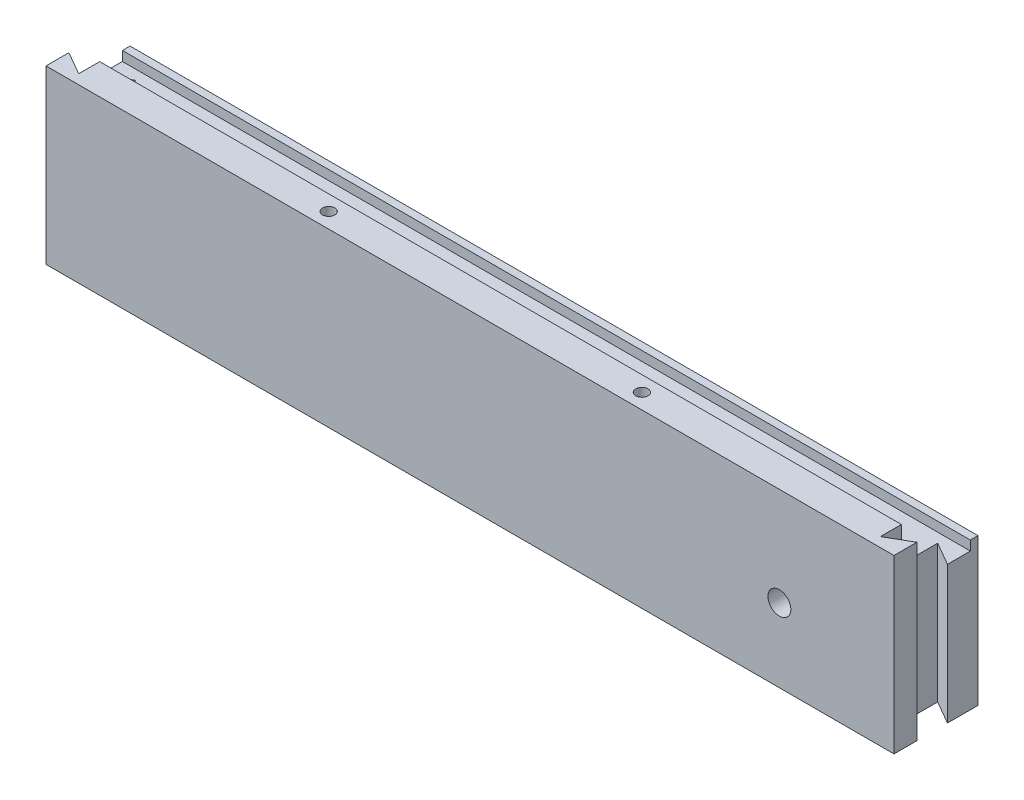
ISO-10303-21;
HEADER;
FILE_DESCRIPTION(('STEP AP214'),'2;1');
FILE_NAME('part.step','',(''),(''),'','','');
FILE_SCHEMA(('AUTOMOTIVE_DESIGN { 1 0 10303 214 1 1 1 1 }'));
ENDSEC;
DATA;
#1=APPLICATION_CONTEXT('core data for automotive mechanical design processes');
#2=APPLICATION_PROTOCOL_DEFINITION('international standard','automotive_design',2000,#1);
#3=PRODUCT_CONTEXT('',#1,'mechanical');
#4=PRODUCT('Part','Part','',(#3));
#5=PRODUCT_RELATED_PRODUCT_CATEGORY('part','',(#4));
#6=PRODUCT_DEFINITION_FORMATION('','',#4);
#7=PRODUCT_DEFINITION_CONTEXT('part definition',#1,'design');
#8=PRODUCT_DEFINITION('design','',#6,#7);
#9=PRODUCT_DEFINITION_SHAPE('','',#8);
#10=(LENGTH_UNIT() NAMED_UNIT(*) SI_UNIT(.MILLI.,.METRE.));
#11=(NAMED_UNIT(*) PLANE_ANGLE_UNIT() SI_UNIT($,.RADIAN.));
#12=(NAMED_UNIT(*) SI_UNIT($,.STERADIAN.) SOLID_ANGLE_UNIT());
#13=UNCERTAINTY_MEASURE_WITH_UNIT(LENGTH_MEASURE(1.E-05),#10,'distance_accuracy_value','');
#14=(GEOMETRIC_REPRESENTATION_CONTEXT(3) GLOBAL_UNCERTAINTY_ASSIGNED_CONTEXT((#13)) GLOBAL_UNIT_ASSIGNED_CONTEXT((#10,
#11,#12)) REPRESENTATION_CONTEXT('',''));
#15=CARTESIAN_POINT('',(0.,0.,0.));
#16=DIRECTION('',(0.,0.,1.));
#17=DIRECTION('',(1.,0.,0.));
#18=AXIS2_PLACEMENT_3D('',#15,#16,#17);
#19=CARTESIAN_POINT('',(0.,0.,0.));
#20=DIRECTION('',(0.,1.,0.));
#21=DIRECTION('',(0.,0.,1.));
#22=AXIS2_PLACEMENT_3D('',#19,#20,#21);
#23=PLANE('',#22);
#24=DIRECTION('',(0.,0.,1.));
#25=VECTOR('',#24,1.);
#26=CARTESIAN_POINT('',(236.,0.,0.));
#27=LINE('',#26,#25);
#28=CARTESIAN_POINT('',(236.,0.,1.99999999999989));
#29=VERTEX_POINT('',#28);
#30=CARTESIAN_POINT('',(236.,0.,8.));
#31=VERTEX_POINT('',#30);
#32=EDGE_CURVE('E310',#29,#31,#27,.T.);
#33=ORIENTED_EDGE('',*,*,#32,.T.);
#34=DIRECTION('',(-1.,0.,0.));
#35=VECTOR('',#34,1.);
#36=CARTESIAN_POINT('',(0.,0.,7.99999999999999));
#37=LINE('',#36,#35);
#38=CARTESIAN_POINT('',(14.,0.,7.99999999999999));
#39=VERTEX_POINT('',#38);
#40=EDGE_CURVE('E56',#31,#39,#37,.T.);
#41=ORIENTED_EDGE('',*,*,#40,.T.);
#42=DIRECTION('',(0.,0.,1.));
#43=VECTOR('',#42,1.);
#44=CARTESIAN_POINT('',(14.,0.,0.));
#45=LINE('',#44,#43);
#46=CARTESIAN_POINT('',(14.,0.,2.));
#47=VERTEX_POINT('',#46);
#48=EDGE_CURVE('E303',#47,#39,#45,.T.);
#49=ORIENTED_EDGE('',*,*,#48,.F.);
#50=DIRECTION('',(0.86602540378444,0.,0.499999999999998));
#51=VECTOR('',#50,1.);
#52=CARTESIAN_POINT('',(2.63397459621554,0.,-4.56217782649105));
#53=LINE('',#52,#51);
#54=CARTESIAN_POINT('',(20.0621778264911,0.,5.5));
#55=VERTEX_POINT('',#54);
#56=EDGE_CURVE('E313',#47,#55,#53,.T.);
#57=ORIENTED_EDGE('',*,*,#56,.T.);
#58=DIRECTION('',(0.,0.,-1.));
#59=VECTOR('',#58,1.);
#60=CARTESIAN_POINT('',(20.0621778264911,0.,0.));
#61=LINE('',#60,#59);
#62=CARTESIAN_POINT('',(20.0621778264911,0.,-9.5));
#63=VERTEX_POINT('',#62);
#64=EDGE_CURVE('E306',#55,#63,#61,.T.);
#65=ORIENTED_EDGE('',*,*,#64,.T.);
#66=DIRECTION('',(-0.86602540378444,0.,0.499999999999997));
#67=VECTOR('',#66,1.);
#68=CARTESIAN_POINT('',(0.901923788646657,0.,1.56217782649103));
#69=LINE('',#68,#67);
#70=CARTESIAN_POINT('',(14.,0.,-6.));
#71=VERTEX_POINT('',#70);
#72=EDGE_CURVE('E299',#63,#71,#69,.T.);
#73=ORIENTED_EDGE('',*,*,#72,.T.);
#74=CARTESIAN_POINT('',(14.,0.,-14.));
#75=VERTEX_POINT('',#74);
#76=EDGE_CURVE('E292',#75,#71,#45,.T.);
#77=ORIENTED_EDGE('',*,*,#76,.F.);
#78=DIRECTION('',(-1.,0.,0.));
#79=VECTOR('',#78,1.);
#80=CARTESIAN_POINT('',(14.,0.,-14.));
#81=LINE('',#80,#79);
#82=CARTESIAN_POINT('',(236.,0.,-14.));
#83=VERTEX_POINT('',#82);
#84=EDGE_CURVE('E189',#83,#75,#81,.T.);
#85=ORIENTED_EDGE('',*,*,#84,.F.);
#86=CARTESIAN_POINT('',(236.,0.,-6.00000000000012));
#87=VERTEX_POINT('',#86);
#88=EDGE_CURVE('E301',#83,#87,#27,.T.);
#89=ORIENTED_EDGE('',*,*,#88,.T.);
#90=DIRECTION('',(0.866025403784441,0.,0.499999999999996));
#91=VECTOR('',#90,1.);
#92=CARTESIAN_POINT('',(61.5980762113523,0.,-106.690997646563));
#93=LINE('',#92,#91);
#94=CARTESIAN_POINT('',(229.937822173509,0.,-9.5000000000001));
#95=VERTEX_POINT('',#94);
#96=EDGE_CURVE('E332',#95,#87,#93,.T.);
#97=ORIENTED_EDGE('',*,*,#96,.F.);
#98=DIRECTION('',(0.,0.,-1.));
#99=VECTOR('',#98,1.);
#100=CARTESIAN_POINT('',(229.937822173509,0.,-4.25470440681991E-13));
#101=LINE('',#100,#99);
#102=CARTESIAN_POINT('',(229.937822173509,0.,5.49999999999989));
#103=VERTEX_POINT('',#102);
#104=EDGE_CURVE('E328',#103,#95,#101,.T.);
#105=ORIENTED_EDGE('',*,*,#104,.F.);
#106=DIRECTION('',(-0.866025403784439,0.,0.499999999999999));
#107=VECTOR('',#106,1.);
#108=CARTESIAN_POINT('',(59.8660254037842,0.,103.690997646564));
#109=LINE('',#108,#107);
#110=EDGE_CURVE('E318',#29,#103,#109,.T.);
#111=ORIENTED_EDGE('',*,*,#110,.F.);
#112=EDGE_LOOP('',(#33,#41,#49,#57,#65,#73,#77,#85,#89,#97,#105,#111));
#113=FACE_BOUND('',#112,.T.);
#114=CARTESIAN_POINT('',(84.,0.,4.));
#115=DIRECTION('',(0.,1.,0.));
#116=DIRECTION('',(0.,0.,1.));
#117=AXIS2_PLACEMENT_3D('',#114,#115,#116);
#118=CIRCLE('',#117,1.59999999999999);
#119=CARTESIAN_POINT('',(84.,0.,5.59999999999999));
#120=VERTEX_POINT('',#119);
#121=EDGE_CURVE('E369',#120,#120,#118,.F.);
#122=ORIENTED_EDGE('',*,*,#121,.F.);
#123=EDGE_LOOP('',(#122));
#124=FACE_BOUND('',#123,.T.);
#125=CARTESIAN_POINT('',(166.,0.,4.));
#126=DIRECTION('',(0.,1.,0.));
#127=DIRECTION('',(0.,0.,1.));
#128=AXIS2_PLACEMENT_3D('',#125,#126,#127);
#129=CIRCLE('',#128,1.59999999999999);
#130=CARTESIAN_POINT('',(166.,0.,5.59999999999999));
#131=VERTEX_POINT('',#130);
#132=EDGE_CURVE('E171',#131,#131,#129,.T.);
#133=ORIENTED_EDGE('',*,*,#132,.T.);
#134=EDGE_LOOP('',(#133));
#135=FACE_BOUND('',#134,.T.);
#136=ADVANCED_FACE('F40',(#113,#124,#135),#23,.F.);
#137=CARTESIAN_POINT('',(0.,45.,0.));
#138=DIRECTION('',(0.,1.,0.));
#139=DIRECTION('',(0.,0.,1.));
#140=AXIS2_PLACEMENT_3D('',#137,#138,#139);
#141=PLANE('',#140);
#142=CARTESIAN_POINT('',(84.,45.,4.));
#143=DIRECTION('',(0.,1.,0.));
#144=DIRECTION('',(0.,0.,1.));
#145=AXIS2_PLACEMENT_3D('',#142,#143,#144);
#146=CIRCLE('',#145,1.59999999999999);
#147=CARTESIAN_POINT('',(84.,45.,5.59999999999999));
#148=VERTEX_POINT('',#147);
#149=EDGE_CURVE('E374',#148,#148,#146,.F.);
#150=ORIENTED_EDGE('',*,*,#149,.T.);
#151=EDGE_LOOP('',(#150));
#152=FACE_BOUND('',#151,.T.);
#153=DIRECTION('',(-1.,0.,0.));
#154=VECTOR('',#153,1.);
#155=CARTESIAN_POINT('',(0.,45.,7.99999999999999));
#156=LINE('',#155,#154);
#157=CARTESIAN_POINT('',(236.,45.,7.99999999999999));
#158=VERTEX_POINT('',#157);
#159=CARTESIAN_POINT('',(14.,45.,7.99999999999999));
#160=VERTEX_POINT('',#159);
#161=EDGE_CURVE('E154',#158,#160,#156,.T.);
#162=ORIENTED_EDGE('',*,*,#161,.F.);
#163=DIRECTION('',(0.,0.,-1.));
#164=VECTOR('',#163,1.);
#165=CARTESIAN_POINT('',(236.,45.,0.));
#166=LINE('',#165,#164);
#167=CARTESIAN_POINT('',(236.,45.,1.99999999999989));
#168=VERTEX_POINT('',#167);
#169=EDGE_CURVE('E165',#158,#168,#166,.T.);
#170=ORIENTED_EDGE('',*,*,#169,.T.);
#171=DIRECTION('',(0.866025403784439,0.,-0.499999999999999));
#172=VECTOR('',#171,1.);
#173=CARTESIAN_POINT('',(59.8660254037842,45.,103.690997646564));
#174=LINE('',#173,#172);
#175=CARTESIAN_POINT('',(229.937822173509,45.,5.49999999999989));
#176=VERTEX_POINT('',#175);
#177=EDGE_CURVE('E181',#176,#168,#174,.T.);
#178=ORIENTED_EDGE('',*,*,#177,.F.);
#179=DIRECTION('',(0.,0.,1.));
#180=VECTOR('',#179,1.);
#181=CARTESIAN_POINT('',(229.937822173509,45.,-4.25470440681991E-13));
#182=LINE('',#181,#180);
#183=CARTESIAN_POINT('',(229.937822173509,45.,0.));
#184=VERTEX_POINT('',#183);
#185=EDGE_CURVE('E275',#184,#176,#182,.T.);
#186=ORIENTED_EDGE('',*,*,#185,.F.);
#187=DIRECTION('',(1.,0.,0.));
#188=VECTOR('',#187,1.);
#189=CARTESIAN_POINT('',(0.,45.,0.));
#190=LINE('',#189,#188);
#191=CARTESIAN_POINT('',(20.0621778264911,45.,0.));
#192=VERTEX_POINT('',#191);
#193=EDGE_CURVE('E209',#192,#184,#190,.T.);
#194=ORIENTED_EDGE('',*,*,#193,.F.);
#195=DIRECTION('',(0.,0.,1.));
#196=VECTOR('',#195,1.);
#197=CARTESIAN_POINT('',(20.0621778264911,45.,0.));
#198=LINE('',#197,#196);
#199=CARTESIAN_POINT('',(20.0621778264911,45.,5.5));
#200=VERTEX_POINT('',#199);
#201=EDGE_CURVE('E269',#192,#200,#198,.T.);
#202=ORIENTED_EDGE('',*,*,#201,.T.);
#203=DIRECTION('',(-0.86602540378444,0.,-0.499999999999998));
#204=VECTOR('',#203,1.);
#205=CARTESIAN_POINT('',(2.63397459621554,45.,-4.56217782649105));
#206=LINE('',#205,#204);
#207=CARTESIAN_POINT('',(14.,45.,2.));
#208=VERTEX_POINT('',#207);
#209=EDGE_CURVE('E177',#200,#208,#206,.T.);
#210=ORIENTED_EDGE('',*,*,#209,.T.);
#211=DIRECTION('',(0.,0.,-1.));
#212=VECTOR('',#211,1.);
#213=CARTESIAN_POINT('',(14.,45.,0.));
#214=LINE('',#213,#212);
#215=EDGE_CURVE('E168',#160,#208,#214,.T.);
#216=ORIENTED_EDGE('',*,*,#215,.F.);
#217=EDGE_LOOP('',(#162,#170,#178,#186,#194,#202,#210,#216));
#218=FACE_BOUND('',#217,.T.);
#219=CARTESIAN_POINT('',(166.,45.,4.));
#220=DIRECTION('',(0.,1.,0.));
#221=DIRECTION('',(0.,0.,1.));
#222=AXIS2_PLACEMENT_3D('',#219,#220,#221);
#223=CIRCLE('',#222,1.59999999999999);
#224=CARTESIAN_POINT('',(166.,45.,5.59999999999999));
#225=VERTEX_POINT('',#224);
#226=EDGE_CURVE('E373',#225,#225,#223,.T.);
#227=ORIENTED_EDGE('',*,*,#226,.F.);
#228=EDGE_LOOP('',(#227));
#229=FACE_BOUND('',#228,.T.);
#230=ADVANCED_FACE('F162',(#152,#218,#229),#141,.T.);
#231=CARTESIAN_POINT('',(0.,38.5,0.));
#232=DIRECTION('',(0.,-1.,0.));
#233=DIRECTION('',(0.,0.,-1.));
#234=AXIS2_PLACEMENT_3D('',#231,#232,#233);
#235=PLANE('',#234);
#236=DIRECTION('',(0.,0.,1.));
#237=VECTOR('',#236,1.);
#238=CARTESIAN_POINT('',(236.,38.5,0.));
#239=LINE('',#238,#237);
#240=CARTESIAN_POINT('',(236.,38.5,-14.));
#241=VERTEX_POINT('',#240);
#242=CARTESIAN_POINT('',(236.,38.5,-12.));
#243=VERTEX_POINT('',#242);
#244=EDGE_CURVE('E183',#241,#243,#239,.T.);
#245=ORIENTED_EDGE('',*,*,#244,.F.);
#246=DIRECTION('',(1.,0.,0.));
#247=VECTOR('',#246,1.);
#248=CARTESIAN_POINT('',(14.,38.5,-14.));
#249=LINE('',#248,#247);
#250=CARTESIAN_POINT('',(14.,38.5,-14.));
#251=VERTEX_POINT('',#250);
#252=EDGE_CURVE('E198',#251,#241,#249,.T.);
#253=ORIENTED_EDGE('',*,*,#252,.F.);
#254=DIRECTION('',(0.,0.,1.));
#255=VECTOR('',#254,1.);
#256=CARTESIAN_POINT('',(14.,38.5,0.));
#257=LINE('',#256,#255);
#258=CARTESIAN_POINT('',(14.,38.5,-12.));
#259=VERTEX_POINT('',#258);
#260=EDGE_CURVE('E253',#251,#259,#257,.T.);
#261=ORIENTED_EDGE('',*,*,#260,.T.);
#262=DIRECTION('',(1.,0.,0.));
#263=VECTOR('',#262,1.);
#264=CARTESIAN_POINT('',(0.,38.5,-12.));
#265=LINE('',#264,#263);
#266=EDGE_CURVE('E193',#259,#243,#265,.T.);
#267=ORIENTED_EDGE('',*,*,#266,.T.);
#268=EDGE_LOOP('',(#245,#253,#261,#267));
#269=FACE_BOUND('',#268,.T.);
#270=ADVANCED_FACE('F285',(#269),#235,.F.);
#271=CARTESIAN_POINT('',(0.,45.,0.));
#272=DIRECTION('',(0.,0.,-1.));
#273=DIRECTION('',(-1.,0.,0.));
#274=AXIS2_PLACEMENT_3D('',#271,#272,#273);
#275=PLANE('',#274);
#276=DIRECTION('',(0.,1.,0.));
#277=VECTOR('',#276,1.);
#278=CARTESIAN_POINT('',(229.937822173509,45.,0.));
#279=LINE('',#278,#277);
#280=CARTESIAN_POINT('',(229.937822173509,36.,0.));
#281=VERTEX_POINT('',#280);
#282=EDGE_CURVE('E64',#281,#184,#279,.T.);
#283=ORIENTED_EDGE('',*,*,#282,.F.);
#284=DIRECTION('',(1.,0.,0.));
#285=VECTOR('',#284,1.);
#286=CARTESIAN_POINT('',(20.0621778264911,36.,0.));
#287=LINE('',#286,#285);
#288=CARTESIAN_POINT('',(20.0621778264911,36.,0.));
#289=VERTEX_POINT('',#288);
#290=EDGE_CURVE('E308',#289,#281,#287,.T.);
#291=ORIENTED_EDGE('',*,*,#290,.F.);
#292=DIRECTION('',(0.,1.,0.));
#293=VECTOR('',#292,1.);
#294=CARTESIAN_POINT('',(20.0621778264911,45.,0.));
#295=LINE('',#294,#293);
#296=EDGE_CURVE('E258',#289,#192,#295,.T.);
#297=ORIENTED_EDGE('',*,*,#296,.T.);
#298=ORIENTED_EDGE('',*,*,#193,.T.);
#299=EDGE_LOOP('',(#283,#291,#297,#298));
#300=FACE_BOUND('',#299,.T.);
#301=ADVANCED_FACE('F42',(#300),#275,.T.);
#302=CARTESIAN_POINT('',(0.,36.,-12.));
#303=DIRECTION('',(0.,0.,1.));
#304=DIRECTION('',(1.,0.,0.));
#305=AXIS2_PLACEMENT_3D('',#302,#303,#304);
#306=PLANE('',#305);
#307=DIRECTION('',(1.,0.,0.));
#308=VECTOR('',#307,1.);
#309=CARTESIAN_POINT('',(0.,36.,-12.));
#310=LINE('',#309,#308);
#311=CARTESIAN_POINT('',(14.,36.,-12.));
#312=VERTEX_POINT('',#311);
#313=CARTESIAN_POINT('',(236.,36.,-12.));
#314=VERTEX_POINT('',#313);
#315=EDGE_CURVE('E194',#312,#314,#310,.T.);
#316=ORIENTED_EDGE('',*,*,#315,.T.);
#317=DIRECTION('',(0.,1.,0.));
#318=VECTOR('',#317,1.);
#319=CARTESIAN_POINT('',(236.,36.,-12.));
#320=LINE('',#319,#318);
#321=EDGE_CURVE('E248',#314,#243,#320,.T.);
#322=ORIENTED_EDGE('',*,*,#321,.T.);
#323=ORIENTED_EDGE('',*,*,#266,.F.);
#324=DIRECTION('',(0.,1.,0.));
#325=VECTOR('',#324,1.);
#326=CARTESIAN_POINT('',(14.,36.,-12.));
#327=LINE('',#326,#325);
#328=EDGE_CURVE('E249',#312,#259,#327,.T.);
#329=ORIENTED_EDGE('',*,*,#328,.F.);
#330=EDGE_LOOP('',(#316,#322,#323,#329));
#331=FACE_BOUND('',#330,.T.);
#332=ADVANCED_FACE('F246',(#331),#306,.T.);
#333=CARTESIAN_POINT('',(0.,36.,0.));
#334=DIRECTION('',(0.,1.,0.));
#335=DIRECTION('',(0.,0.,1.));
#336=AXIS2_PLACEMENT_3D('',#333,#334,#335);
#337=PLANE('',#336);
#338=DIRECTION('',(-0.866025403784441,0.,-0.499999999999996));
#339=VECTOR('',#338,1.);
#340=CARTESIAN_POINT('',(61.5980762113523,36.,-106.690997646563));
#341=LINE('',#340,#339);
#342=CARTESIAN_POINT('',(236.,36.,-6.00000000000012));
#343=VERTEX_POINT('',#342);
#344=CARTESIAN_POINT('',(229.937822173509,36.,-9.5000000000001));
#345=VERTEX_POINT('',#344);
#346=EDGE_CURVE('E229',#343,#345,#341,.T.);
#347=ORIENTED_EDGE('',*,*,#346,.F.);
#348=DIRECTION('',(0.,0.,-1.));
#349=VECTOR('',#348,1.);
#350=CARTESIAN_POINT('',(236.,36.,0.));
#351=LINE('',#350,#349);
#352=EDGE_CURVE('E50',#343,#314,#351,.T.);
#353=ORIENTED_EDGE('',*,*,#352,.T.);
#354=ORIENTED_EDGE('',*,*,#315,.F.);
#355=DIRECTION('',(0.,0.,-1.));
#356=VECTOR('',#355,1.);
#357=CARTESIAN_POINT('',(14.,36.,0.));
#358=LINE('',#357,#356);
#359=CARTESIAN_POINT('',(14.,36.,-6.));
#360=VERTEX_POINT('',#359);
#361=EDGE_CURVE('E215',#360,#312,#358,.T.);
#362=ORIENTED_EDGE('',*,*,#361,.F.);
#363=DIRECTION('',(0.86602540378444,0.,-0.499999999999997));
#364=VECTOR('',#363,1.);
#365=CARTESIAN_POINT('',(0.901923788646657,36.,1.56217782649103));
#366=LINE('',#365,#364);
#367=CARTESIAN_POINT('',(20.0621778264911,36.,-9.5));
#368=VERTEX_POINT('',#367);
#369=EDGE_CURVE('E218',#360,#368,#366,.T.);
#370=ORIENTED_EDGE('',*,*,#369,.T.);
#371=DIRECTION('',(0.,0.,1.));
#372=VECTOR('',#371,1.);
#373=CARTESIAN_POINT('',(20.0621778264911,36.,0.));
#374=LINE('',#373,#372);
#375=EDGE_CURVE('E222',#368,#289,#374,.T.);
#376=ORIENTED_EDGE('',*,*,#375,.T.);
#377=ORIENTED_EDGE('',*,*,#290,.T.);
#378=DIRECTION('',(0.,0.,1.));
#379=VECTOR('',#378,1.);
#380=CARTESIAN_POINT('',(229.937822173509,36.,-4.25470440681991E-13));
#381=LINE('',#380,#379);
#382=EDGE_CURVE('E226',#345,#281,#381,.T.);
#383=ORIENTED_EDGE('',*,*,#382,.F.);
#384=EDGE_LOOP('',(#347,#353,#354,#362,#370,#376,#377,#383));
#385=FACE_BOUND('',#384,.T.);
#386=ADVANCED_FACE('F238',(#385),#337,.T.);
#387=CARTESIAN_POINT('',(14.,33.5,-14.));
#388=DIRECTION('',(0.,0.,1.));
#389=DIRECTION('',(1.,0.,0.));
#390=AXIS2_PLACEMENT_3D('',#387,#388,#389);
#391=PLANE('',#390);
#392=CARTESIAN_POINT('',(206.,19.25,-14.));
#393=DIRECTION('',(0.,0.,-1.));
#394=DIRECTION('',(-1.,0.,0.));
#395=AXIS2_PLACEMENT_3D('',#392,#393,#394);
#396=CIRCLE('',#395,2.99999999999999);
#397=CARTESIAN_POINT('',(203.,19.25,-14.));
#398=VERTEX_POINT('',#397);
#399=EDGE_CURVE('E381',#398,#398,#396,.T.);
#400=ORIENTED_EDGE('',*,*,#399,.F.);
#401=EDGE_LOOP('',(#400));
#402=FACE_BOUND('',#401,.T.);
#403=ORIENTED_EDGE('',*,*,#252,.T.);
#404=DIRECTION('',(0.,1.,0.));
#405=VECTOR('',#404,1.);
#406=CARTESIAN_POINT('',(236.,33.5,-14.));
#407=LINE('',#406,#405);
#408=EDGE_CURVE('E206',#83,#241,#407,.T.);
#409=ORIENTED_EDGE('',*,*,#408,.F.);
#410=ORIENTED_EDGE('',*,*,#84,.T.);
#411=DIRECTION('',(0.,1.,0.));
#412=VECTOR('',#411,1.);
#413=CARTESIAN_POINT('',(14.,33.5,-14.));
#414=LINE('',#413,#412);
#415=EDGE_CURVE('E205',#75,#251,#414,.T.);
#416=ORIENTED_EDGE('',*,*,#415,.T.);
#417=EDGE_LOOP('',(#403,#409,#410,#416));
#418=FACE_BOUND('',#417,.T.);
#419=ADVANCED_FACE('F287',(#402,#418),#391,.F.);
#420=CARTESIAN_POINT('',(14.,126.5,0.));
#421=DIRECTION('',(1.,0.,0.));
#422=DIRECTION('',(0.,0.,-1.));
#423=AXIS2_PLACEMENT_3D('',#420,#421,#422);
#424=PLANE('',#423);
#425=ORIENTED_EDGE('',*,*,#48,.T.);
#426=DIRECTION('',(0.,1.,0.));
#427=VECTOR('',#426,1.);
#428=CARTESIAN_POINT('',(14.,-15.5,7.99999999999999));
#429=LINE('',#428,#427);
#430=EDGE_CURVE('E170',#39,#160,#429,.T.);
#431=ORIENTED_EDGE('',*,*,#430,.T.);
#432=ORIENTED_EDGE('',*,*,#215,.T.);
#433=DIRECTION('',(0.,-1.,0.));
#434=VECTOR('',#433,1.);
#435=CARTESIAN_POINT('',(14.,126.5,2.));
#436=LINE('',#435,#434);
#437=EDGE_CURVE('E343',#208,#47,#436,.T.);
#438=ORIENTED_EDGE('',*,*,#437,.T.);
#439=EDGE_LOOP('',(#425,#431,#432,#438));
#440=FACE_BOUND('',#439,.T.);
#441=ADVANCED_FACE('F413',(#440),#424,.F.);
#442=ORIENTED_EDGE('',*,*,#76,.T.);
#443=DIRECTION('',(0.,-1.,0.));
#444=VECTOR('',#443,1.);
#445=CARTESIAN_POINT('',(14.,126.5,-6.));
#446=LINE('',#445,#444);
#447=EDGE_CURVE('E263',#360,#71,#446,.T.);
#448=ORIENTED_EDGE('',*,*,#447,.F.);
#449=ORIENTED_EDGE('',*,*,#361,.T.);
#450=ORIENTED_EDGE('',*,*,#328,.T.);
#451=ORIENTED_EDGE('',*,*,#260,.F.);
#452=ORIENTED_EDGE('',*,*,#415,.F.);
#453=EDGE_LOOP('',(#442,#448,#449,#450,#451,#452));
#454=FACE_BOUND('',#453,.T.);
#455=ADVANCED_FACE('F291',(#454),#424,.F.);
#456=CARTESIAN_POINT('',(0.901923788646657,126.5,1.56217782649103));
#457=DIRECTION('',(0.499999999999997,0.,0.86602540378444));
#458=DIRECTION('',(0.86602540378444,0.,-0.499999999999997));
#459=AXIS2_PLACEMENT_3D('',#456,#457,#458);
#460=PLANE('',#459);
#461=ORIENTED_EDGE('',*,*,#447,.T.);
#462=ORIENTED_EDGE('',*,*,#72,.F.);
#463=DIRECTION('',(0.,-1.,0.));
#464=VECTOR('',#463,1.);
#465=CARTESIAN_POINT('',(20.0621778264911,126.5,-9.5));
#466=LINE('',#465,#464);
#467=EDGE_CURVE('E348',#368,#63,#466,.T.);
#468=ORIENTED_EDGE('',*,*,#467,.F.);
#469=ORIENTED_EDGE('',*,*,#369,.F.);
#470=EDGE_LOOP('',(#461,#462,#468,#469));
#471=FACE_BOUND('',#470,.T.);
#472=ADVANCED_FACE('F356',(#471),#460,.T.);
#473=CARTESIAN_POINT('',(20.0621778264911,126.5,0.));
#474=DIRECTION('',(-1.,0.,0.));
#475=DIRECTION('',(0.,0.,1.));
#476=AXIS2_PLACEMENT_3D('',#473,#474,#475);
#477=PLANE('',#476);
#478=ORIENTED_EDGE('',*,*,#296,.F.);
#479=ORIENTED_EDGE('',*,*,#375,.F.);
#480=ORIENTED_EDGE('',*,*,#467,.T.);
#481=ORIENTED_EDGE('',*,*,#64,.F.);
#482=DIRECTION('',(0.,-1.,0.));
#483=VECTOR('',#482,1.);
#484=CARTESIAN_POINT('',(20.0621778264911,126.5,5.5));
#485=LINE('',#484,#483);
#486=EDGE_CURVE('E346',#200,#55,#485,.T.);
#487=ORIENTED_EDGE('',*,*,#486,.F.);
#488=ORIENTED_EDGE('',*,*,#201,.F.);
#489=EDGE_LOOP('',(#478,#479,#480,#481,#487,#488));
#490=FACE_BOUND('',#489,.T.);
#491=ADVANCED_FACE('F421',(#490),#477,.T.);
#492=CARTESIAN_POINT('',(2.63397459621554,126.5,-4.56217782649105));
#493=DIRECTION('',(0.499999999999998,0.,-0.86602540378444));
#494=DIRECTION('',(-0.86602540378444,0.,-0.499999999999998));
#495=AXIS2_PLACEMENT_3D('',#492,#493,#494);
#496=PLANE('',#495);
#497=ORIENTED_EDGE('',*,*,#486,.T.);
#498=ORIENTED_EDGE('',*,*,#56,.F.);
#499=ORIENTED_EDGE('',*,*,#437,.F.);
#500=ORIENTED_EDGE('',*,*,#209,.F.);
#501=EDGE_LOOP('',(#497,#498,#499,#500));
#502=FACE_BOUND('',#501,.T.);
#503=ADVANCED_FACE('F424',(#502),#496,.T.);
#504=CARTESIAN_POINT('',(236.,126.5,0.));
#505=DIRECTION('',(1.,0.,0.));
#506=DIRECTION('',(0.,0.,-1.));
#507=AXIS2_PLACEMENT_3D('',#504,#505,#506);
#508=PLANE('',#507);
#509=ORIENTED_EDGE('',*,*,#408,.T.);
#510=ORIENTED_EDGE('',*,*,#244,.T.);
#511=ORIENTED_EDGE('',*,*,#321,.F.);
#512=ORIENTED_EDGE('',*,*,#352,.F.);
#513=DIRECTION('',(0.,-1.,0.));
#514=VECTOR('',#513,1.);
#515=CARTESIAN_POINT('',(236.,126.5,-6.00000000000012));
#516=LINE('',#515,#514);
#517=EDGE_CURVE('E254',#343,#87,#516,.T.);
#518=ORIENTED_EDGE('',*,*,#517,.T.);
#519=ORIENTED_EDGE('',*,*,#88,.F.);
#520=EDGE_LOOP('',(#509,#510,#511,#512,#518,#519));
#521=FACE_BOUND('',#520,.T.);
#522=ADVANCED_FACE('F281',(#521),#508,.T.);
#523=CARTESIAN_POINT('',(61.5980762113523,126.5,-106.690997646563));
#524=DIRECTION('',(0.499999999999996,0.,-0.866025403784441));
#525=DIRECTION('',(-0.866025403784441,0.,-0.499999999999996));
#526=AXIS2_PLACEMENT_3D('',#523,#524,#525);
#527=PLANE('',#526);
#528=ORIENTED_EDGE('',*,*,#346,.T.);
#529=DIRECTION('',(0.,-1.,0.));
#530=VECTOR('',#529,1.);
#531=CARTESIAN_POINT('',(229.937822173509,126.5,-9.5000000000001));
#532=LINE('',#531,#530);
#533=EDGE_CURVE('E260',#345,#95,#532,.T.);
#534=ORIENTED_EDGE('',*,*,#533,.T.);
#535=ORIENTED_EDGE('',*,*,#96,.T.);
#536=ORIENTED_EDGE('',*,*,#517,.F.);
#537=EDGE_LOOP('',(#528,#534,#535,#536));
#538=FACE_BOUND('',#537,.T.);
#539=ADVANCED_FACE('F438',(#538),#527,.F.);
#540=CARTESIAN_POINT('',(229.937822173509,126.5,-4.25470440681991E-13));
#541=DIRECTION('',(-1.,0.,0.));
#542=DIRECTION('',(0.,0.,1.));
#543=AXIS2_PLACEMENT_3D('',#540,#541,#542);
#544=PLANE('',#543);
#545=ORIENTED_EDGE('',*,*,#382,.T.);
#546=ORIENTED_EDGE('',*,*,#282,.T.);
#547=ORIENTED_EDGE('',*,*,#185,.T.);
#548=DIRECTION('',(0.,-1.,0.));
#549=VECTOR('',#548,1.);
#550=CARTESIAN_POINT('',(229.937822173509,126.5,5.49999999999989));
#551=LINE('',#550,#549);
#552=EDGE_CURVE('E338',#176,#103,#551,.T.);
#553=ORIENTED_EDGE('',*,*,#552,.T.);
#554=ORIENTED_EDGE('',*,*,#104,.T.);
#555=ORIENTED_EDGE('',*,*,#533,.F.);
#556=EDGE_LOOP('',(#545,#546,#547,#553,#554,#555));
#557=FACE_BOUND('',#556,.T.);
#558=ADVANCED_FACE('F434',(#557),#544,.F.);
#559=CARTESIAN_POINT('',(59.8660254037842,126.5,103.690997646564));
#560=DIRECTION('',(0.499999999999999,0.,0.866025403784439));
#561=DIRECTION('',(0.866025403784439,0.,-0.499999999999999));
#562=AXIS2_PLACEMENT_3D('',#559,#560,#561);
#563=PLANE('',#562);
#564=ORIENTED_EDGE('',*,*,#177,.T.);
#565=DIRECTION('',(0.,-1.,0.));
#566=VECTOR('',#565,1.);
#567=CARTESIAN_POINT('',(236.,126.5,1.99999999999989));
#568=LINE('',#567,#566);
#569=EDGE_CURVE('E175',#168,#29,#568,.T.);
#570=ORIENTED_EDGE('',*,*,#569,.T.);
#571=ORIENTED_EDGE('',*,*,#110,.T.);
#572=ORIENTED_EDGE('',*,*,#552,.F.);
#573=EDGE_LOOP('',(#564,#570,#571,#572));
#574=FACE_BOUND('',#573,.T.);
#575=ADVANCED_FACE('F431',(#574),#563,.F.);
#576=DIRECTION('',(0.,1.,0.));
#577=VECTOR('',#576,1.);
#578=CARTESIAN_POINT('',(236.,126.5,8.));
#579=LINE('',#578,#577);
#580=EDGE_CURVE('E11',#31,#158,#579,.T.);
#581=ORIENTED_EDGE('',*,*,#580,.F.);
#582=ORIENTED_EDGE('',*,*,#32,.F.);
#583=ORIENTED_EDGE('',*,*,#569,.F.);
#584=ORIENTED_EDGE('',*,*,#169,.F.);
#585=EDGE_LOOP('',(#581,#582,#583,#584));
#586=FACE_BOUND('',#585,.T.);
#587=ADVANCED_FACE('F174',(#586),#508,.T.);
#588=CARTESIAN_POINT('',(0.,-15.5,7.99999999999999));
#589=DIRECTION('',(0.,0.,-1.));
#590=DIRECTION('',(-1.,0.,0.));
#591=AXIS2_PLACEMENT_3D('',#588,#589,#590);
#592=PLANE('',#591);
#593=CARTESIAN_POINT('',(206.,19.25,8.));
#594=DIRECTION('',(0.,0.,-1.));
#595=DIRECTION('',(-1.,0.,0.));
#596=AXIS2_PLACEMENT_3D('',#593,#594,#595);
#597=CIRCLE('',#596,2.99999999999999);
#598=CARTESIAN_POINT('',(203.,19.25,8.));
#599=VERTEX_POINT('',#598);
#600=EDGE_CURVE('E44',#599,#599,#597,.T.);
#601=ORIENTED_EDGE('',*,*,#600,.T.);
#602=EDGE_LOOP('',(#601));
#603=FACE_BOUND('',#602,.T.);
#604=ORIENTED_EDGE('',*,*,#580,.T.);
#605=ORIENTED_EDGE('',*,*,#161,.T.);
#606=ORIENTED_EDGE('',*,*,#430,.F.);
#607=ORIENTED_EDGE('',*,*,#40,.F.);
#608=EDGE_LOOP('',(#604,#605,#606,#607));
#609=FACE_BOUND('',#608,.T.);
#610=ADVANCED_FACE('F153',(#603,#609),#592,.F.);
#611=CARTESIAN_POINT('',(84.,-15.5,4.));
#612=DIRECTION('',(0.,1.,0.));
#613=DIRECTION('',(0.,0.,1.));
#614=AXIS2_PLACEMENT_3D('',#611,#612,#613);
#615=CYLINDRICAL_SURFACE('',#614,1.59999999999999);
#616=ORIENTED_EDGE('',*,*,#149,.F.);
#617=EDGE_LOOP('',(#616));
#618=FACE_BOUND('',#617,.T.);
#619=ORIENTED_EDGE('',*,*,#121,.T.);
#620=EDGE_LOOP('',(#619));
#621=FACE_BOUND('',#620,.T.);
#622=ADVANCED_FACE('F398',(#618,#621),#615,.F.);
#623=CARTESIAN_POINT('',(166.,-15.5,4.));
#624=DIRECTION('',(0.,1.,0.));
#625=DIRECTION('',(0.,0.,1.));
#626=AXIS2_PLACEMENT_3D('',#623,#624,#625);
#627=CYLINDRICAL_SURFACE('',#626,1.59999999999999);
#628=ORIENTED_EDGE('',*,*,#226,.T.);
#629=EDGE_LOOP('',(#628));
#630=FACE_BOUND('',#629,.T.);
#631=ORIENTED_EDGE('',*,*,#132,.F.);
#632=EDGE_LOOP('',(#631));
#633=FACE_BOUND('',#632,.T.);
#634=ADVANCED_FACE('F393',(#630,#633),#627,.F.);
#635=CARTESIAN_POINT('',(206.,19.25,26.));
#636=DIRECTION('',(0.,0.,-1.));
#637=DIRECTION('',(-1.,0.,0.));
#638=AXIS2_PLACEMENT_3D('',#635,#636,#637);
#639=CYLINDRICAL_SURFACE('',#638,2.99999999999999);
#640=ORIENTED_EDGE('',*,*,#399,.T.);
#641=EDGE_LOOP('',(#640));
#642=FACE_BOUND('',#641,.T.);
#643=ORIENTED_EDGE('',*,*,#600,.F.);
#644=EDGE_LOOP('',(#643));
#645=FACE_BOUND('',#644,.T.);
#646=ADVANCED_FACE('F391',(#642,#645),#639,.F.);
#647=CLOSED_SHELL('',(#136,#230,#270,#301,#332,#386,#419,#441,#455,#472,#491,#503,#522,#539,
#558,#575,#587,#610,#622,#634,#646));
#648=MANIFOLD_SOLID_BREP('B2',#647);
#649=ADVANCED_BREP_SHAPE_REPRESENTATION('',(#18,#648),#14);
#650=SHAPE_DEFINITION_REPRESENTATION(#9,#649);
ENDSEC;
END-ISO-10303-21;
